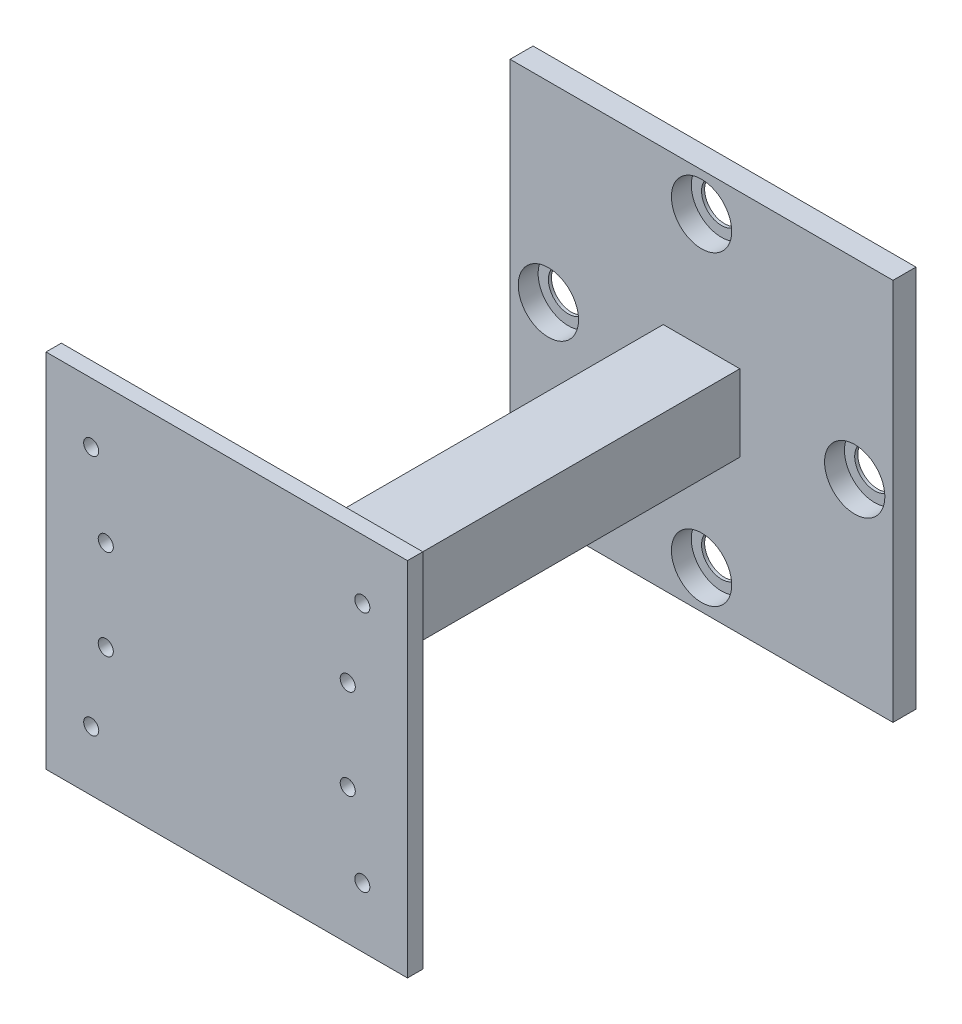
ISO-10303-21;
HEADER;
FILE_DESCRIPTION(('STEP AP214'),'2;1');
FILE_NAME('part.step','',(''),(''),'','','');
FILE_SCHEMA(('AUTOMOTIVE_DESIGN { 1 0 10303 214 1 1 1 1 }'));
ENDSEC;
DATA;
#1=APPLICATION_CONTEXT('core data for automotive mechanical design processes');
#2=APPLICATION_PROTOCOL_DEFINITION('international standard','automotive_design',2000,#1);
#3=PRODUCT_CONTEXT('',#1,'mechanical');
#4=PRODUCT('Part','Part','',(#3));
#5=PRODUCT_RELATED_PRODUCT_CATEGORY('part','',(#4));
#6=PRODUCT_DEFINITION_FORMATION('','',#4);
#7=PRODUCT_DEFINITION_CONTEXT('part definition',#1,'design');
#8=PRODUCT_DEFINITION('design','',#6,#7);
#9=PRODUCT_DEFINITION_SHAPE('','',#8);
#10=(LENGTH_UNIT() NAMED_UNIT(*) SI_UNIT(.MILLI.,.METRE.));
#11=(NAMED_UNIT(*) PLANE_ANGLE_UNIT() SI_UNIT($,.RADIAN.));
#12=(NAMED_UNIT(*) SI_UNIT($,.STERADIAN.) SOLID_ANGLE_UNIT());
#13=UNCERTAINTY_MEASURE_WITH_UNIT(LENGTH_MEASURE(1.E-05),#10,'distance_accuracy_value','');
#14=(GEOMETRIC_REPRESENTATION_CONTEXT(3) GLOBAL_UNCERTAINTY_ASSIGNED_CONTEXT((#13)) GLOBAL_UNIT_ASSIGNED_CONTEXT((#10,
#11,#12)) REPRESENTATION_CONTEXT('',''));
#15=CARTESIAN_POINT('',(0.,0.,0.));
#16=DIRECTION('',(0.,0.,1.));
#17=DIRECTION('',(1.,0.,0.));
#18=AXIS2_PLACEMENT_3D('',#15,#16,#17);
#19=CARTESIAN_POINT('',(0.,63.5,3.81));
#20=DIRECTION('',(1.,0.,0.));
#21=DIRECTION('',(0.,0.,-1.));
#22=AXIS2_PLACEMENT_3D('',#19,#20,#21);
#23=PLANE('',#22);
#24=DIRECTION('',(0.,-1.,0.));
#25=VECTOR('',#24,1.);
#26=CARTESIAN_POINT('',(0.,63.5,0.));
#27=LINE('',#26,#25);
#28=CARTESIAN_POINT('',(0.,63.5,0.));
#29=VERTEX_POINT('',#28);
#30=CARTESIAN_POINT('',(0.,0.,0.));
#31=VERTEX_POINT('',#30);
#32=EDGE_CURVE('E213',#29,#31,#27,.T.);
#33=ORIENTED_EDGE('',*,*,#32,.T.);
#34=DIRECTION('',(0.,0.,-1.));
#35=VECTOR('',#34,1.);
#36=CARTESIAN_POINT('',(0.,0.,3.81));
#37=LINE('',#36,#35);
#38=CARTESIAN_POINT('',(0.,0.,3.81));
#39=VERTEX_POINT('',#38);
#40=EDGE_CURVE('E11',#39,#31,#37,.T.);
#41=ORIENTED_EDGE('',*,*,#40,.F.);
#42=DIRECTION('',(0.,-1.,0.));
#43=VECTOR('',#42,1.);
#44=CARTESIAN_POINT('',(0.,63.5,3.81));
#45=LINE('',#44,#43);
#46=CARTESIAN_POINT('',(0.,63.5,3.81));
#47=VERTEX_POINT('',#46);
#48=EDGE_CURVE('E214',#47,#39,#45,.T.);
#49=ORIENTED_EDGE('',*,*,#48,.F.);
#50=DIRECTION('',(0.,0.,-1.));
#51=VECTOR('',#50,1.);
#52=CARTESIAN_POINT('',(0.,63.5,3.81));
#53=LINE('',#52,#51);
#54=EDGE_CURVE('E228',#47,#29,#53,.T.);
#55=ORIENTED_EDGE('',*,*,#54,.T.);
#56=EDGE_LOOP('',(#33,#41,#49,#55));
#57=FACE_BOUND('',#56,.T.);
#58=ADVANCED_FACE('F45',(#57),#23,.F.);
#59=CARTESIAN_POINT('',(0.,0.,3.81));
#60=DIRECTION('',(0.,1.,0.));
#61=DIRECTION('',(0.,0.,1.));
#62=AXIS2_PLACEMENT_3D('',#59,#60,#61);
#63=PLANE('',#62);
#64=DIRECTION('',(1.,0.,0.));
#65=VECTOR('',#64,1.);
#66=CARTESIAN_POINT('',(0.,0.,0.));
#67=LINE('',#66,#65);
#68=CARTESIAN_POINT('',(63.5,0.,0.));
#69=VERTEX_POINT('',#68);
#70=EDGE_CURVE('E232',#31,#69,#67,.T.);
#71=ORIENTED_EDGE('',*,*,#70,.T.);
#72=DIRECTION('',(0.,0.,-1.));
#73=VECTOR('',#72,1.);
#74=CARTESIAN_POINT('',(63.5,0.,3.81));
#75=LINE('',#74,#73);
#76=CARTESIAN_POINT('',(63.5,0.,3.81));
#77=VERTEX_POINT('',#76);
#78=EDGE_CURVE('E54',#77,#69,#75,.T.);
#79=ORIENTED_EDGE('',*,*,#78,.F.);
#80=DIRECTION('',(1.,0.,0.));
#81=VECTOR('',#80,1.);
#82=CARTESIAN_POINT('',(0.,0.,3.81));
#83=LINE('',#82,#81);
#84=EDGE_CURVE('E218',#39,#77,#83,.T.);
#85=ORIENTED_EDGE('',*,*,#84,.F.);
#86=ORIENTED_EDGE('',*,*,#40,.T.);
#87=EDGE_LOOP('',(#71,#79,#85,#86));
#88=FACE_BOUND('',#87,.T.);
#89=ADVANCED_FACE('F419',(#88),#63,.F.);
#90=CARTESIAN_POINT('',(63.5,0.,3.81));
#91=DIRECTION('',(-1.,0.,0.));
#92=DIRECTION('',(0.,0.,1.));
#93=AXIS2_PLACEMENT_3D('',#90,#91,#92);
#94=PLANE('',#93);
#95=DIRECTION('',(0.,1.,0.));
#96=VECTOR('',#95,1.);
#97=CARTESIAN_POINT('',(63.5,0.,0.));
#98=LINE('',#97,#96);
#99=CARTESIAN_POINT('',(63.5,63.5,0.));
#100=VERTEX_POINT('',#99);
#101=EDGE_CURVE('E235',#69,#100,#98,.T.);
#102=ORIENTED_EDGE('',*,*,#101,.T.);
#103=DIRECTION('',(0.,0.,-1.));
#104=VECTOR('',#103,1.);
#105=CARTESIAN_POINT('',(63.5,63.5,3.81));
#106=LINE('',#105,#104);
#107=CARTESIAN_POINT('',(63.5,63.5,3.81));
#108=VERTEX_POINT('',#107);
#109=EDGE_CURVE('E243',#108,#100,#106,.T.);
#110=ORIENTED_EDGE('',*,*,#109,.F.);
#111=DIRECTION('',(0.,1.,0.));
#112=VECTOR('',#111,1.);
#113=CARTESIAN_POINT('',(63.5,0.,3.81));
#114=LINE('',#113,#112);
#115=EDGE_CURVE('E222',#77,#108,#114,.T.);
#116=ORIENTED_EDGE('',*,*,#115,.F.);
#117=ORIENTED_EDGE('',*,*,#78,.T.);
#118=EDGE_LOOP('',(#102,#110,#116,#117));
#119=FACE_BOUND('',#118,.T.);
#120=ADVANCED_FACE('F424',(#119),#94,.F.);
#121=CARTESIAN_POINT('',(63.5,63.5,3.81));
#122=DIRECTION('',(0.,-1.,0.));
#123=DIRECTION('',(0.,0.,-1.));
#124=AXIS2_PLACEMENT_3D('',#121,#122,#123);
#125=PLANE('',#124);
#126=DIRECTION('',(-1.,0.,0.));
#127=VECTOR('',#126,1.);
#128=CARTESIAN_POINT('',(63.5,63.5,0.));
#129=LINE('',#128,#127);
#130=EDGE_CURVE('E219',#100,#29,#129,.T.);
#131=ORIENTED_EDGE('',*,*,#130,.T.);
#132=ORIENTED_EDGE('',*,*,#54,.F.);
#133=DIRECTION('',(-1.,0.,0.));
#134=VECTOR('',#133,1.);
#135=CARTESIAN_POINT('',(63.5,63.5,3.81));
#136=LINE('',#135,#134);
#137=EDGE_CURVE('E225',#108,#47,#136,.T.);
#138=ORIENTED_EDGE('',*,*,#137,.F.);
#139=ORIENTED_EDGE('',*,*,#109,.T.);
#140=EDGE_LOOP('',(#131,#132,#138,#139));
#141=FACE_BOUND('',#140,.T.);
#142=ADVANCED_FACE('F441',(#141),#125,.F.);
#143=CARTESIAN_POINT('',(0.,0.,3.81));
#144=DIRECTION('',(0.,0.,1.));
#145=DIRECTION('',(1.,0.,0.));
#146=AXIS2_PLACEMENT_3D('',#143,#144,#145);
#147=PLANE('',#146);
#148=CARTESIAN_POINT('',(57.15,31.75,3.81));
#149=DIRECTION('',(0.,0.,1.));
#150=DIRECTION('',(1.,0.,0.));
#151=AXIS2_PLACEMENT_3D('',#148,#149,#150);
#152=CIRCLE('',#151,5.);
#153=CARTESIAN_POINT('',(62.15,31.75,3.81));
#154=VERTEX_POINT('',#153);
#155=EDGE_CURVE('E277',#154,#154,#152,.T.);
#156=ORIENTED_EDGE('',*,*,#155,.F.);
#157=EDGE_LOOP('',(#156));
#158=FACE_BOUND('',#157,.T.);
#159=CARTESIAN_POINT('',(31.75,6.35,3.81));
#160=DIRECTION('',(0.,0.,1.));
#161=DIRECTION('',(1.,0.,0.));
#162=AXIS2_PLACEMENT_3D('',#159,#160,#161);
#163=CIRCLE('',#162,5.);
#164=CARTESIAN_POINT('',(36.75,6.35,3.81));
#165=VERTEX_POINT('',#164);
#166=EDGE_CURVE('E271',#165,#165,#163,.T.);
#167=ORIENTED_EDGE('',*,*,#166,.F.);
#168=EDGE_LOOP('',(#167));
#169=FACE_BOUND('',#168,.T.);
#170=CARTESIAN_POINT('',(31.75,57.15,3.81));
#171=DIRECTION('',(0.,0.,1.));
#172=DIRECTION('',(1.,0.,0.));
#173=AXIS2_PLACEMENT_3D('',#170,#171,#172);
#174=CIRCLE('',#173,5.);
#175=CARTESIAN_POINT('',(36.75,57.15,3.81));
#176=VERTEX_POINT('',#175);
#177=EDGE_CURVE('E265',#176,#176,#174,.T.);
#178=ORIENTED_EDGE('',*,*,#177,.F.);
#179=EDGE_LOOP('',(#178));
#180=FACE_BOUND('',#179,.T.);
#181=CARTESIAN_POINT('',(6.35,31.75,3.81));
#182=DIRECTION('',(0.,0.,1.));
#183=DIRECTION('',(1.,0.,0.));
#184=AXIS2_PLACEMENT_3D('',#181,#182,#183);
#185=CIRCLE('',#184,5.);
#186=CARTESIAN_POINT('',(11.35,31.75,3.81));
#187=VERTEX_POINT('',#186);
#188=EDGE_CURVE('E259',#187,#187,#185,.T.);
#189=ORIENTED_EDGE('',*,*,#188,.F.);
#190=EDGE_LOOP('',(#189));
#191=FACE_BOUND('',#190,.T.);
#192=DIRECTION('',(-1.,0.,0.));
#193=VECTOR('',#192,1.);
#194=CARTESIAN_POINT('',(38.1,38.1,3.81));
#195=LINE('',#194,#193);
#196=CARTESIAN_POINT('',(38.1,38.1,3.81));
#197=VERTEX_POINT('',#196);
#198=CARTESIAN_POINT('',(25.4,38.1,3.81));
#199=VERTEX_POINT('',#198);
#200=EDGE_CURVE('E62',#197,#199,#195,.T.);
#201=ORIENTED_EDGE('',*,*,#200,.F.);
#202=DIRECTION('',(0.,1.,0.));
#203=VECTOR('',#202,1.);
#204=CARTESIAN_POINT('',(38.1,25.4,3.81));
#205=LINE('',#204,#203);
#206=CARTESIAN_POINT('',(38.1,25.4,3.81));
#207=VERTEX_POINT('',#206);
#208=EDGE_CURVE('E66',#207,#197,#205,.T.);
#209=ORIENTED_EDGE('',*,*,#208,.F.);
#210=DIRECTION('',(1.,0.,0.));
#211=VECTOR('',#210,1.);
#212=CARTESIAN_POINT('',(25.4,25.4,3.81));
#213=LINE('',#212,#211);
#214=CARTESIAN_POINT('',(25.4,25.4,3.81));
#215=VERTEX_POINT('',#214);
#216=EDGE_CURVE('E193',#215,#207,#213,.T.);
#217=ORIENTED_EDGE('',*,*,#216,.F.);
#218=DIRECTION('',(0.,-1.,0.));
#219=VECTOR('',#218,1.);
#220=CARTESIAN_POINT('',(25.4,38.1,3.81));
#221=LINE('',#220,#219);
#222=EDGE_CURVE('E167',#199,#215,#221,.T.);
#223=ORIENTED_EDGE('',*,*,#222,.F.);
#224=EDGE_LOOP('',(#201,#209,#217,#223));
#225=FACE_BOUND('',#224,.T.);
#226=ORIENTED_EDGE('',*,*,#48,.T.);
#227=ORIENTED_EDGE('',*,*,#84,.T.);
#228=ORIENTED_EDGE('',*,*,#115,.T.);
#229=ORIENTED_EDGE('',*,*,#137,.T.);
#230=EDGE_LOOP('',(#226,#227,#228,#229));
#231=FACE_BOUND('',#230,.T.);
#232=ADVANCED_FACE('F437',(#158,#169,#180,#191,#225,#231),#147,.T.);
#233=CARTESIAN_POINT('',(0.,0.,0.));
#234=DIRECTION('',(0.,0.,1.));
#235=DIRECTION('',(1.,0.,0.));
#236=AXIS2_PLACEMENT_3D('',#233,#234,#235);
#237=PLANE('',#236);
#238=CARTESIAN_POINT('',(57.15,31.75,0.));
#239=DIRECTION('',(0.,0.,1.));
#240=DIRECTION('',(1.,0.,0.));
#241=AXIS2_PLACEMENT_3D('',#238,#239,#240);
#242=CIRCLE('',#241,3.3);
#243=CARTESIAN_POINT('',(60.45,31.75,0.));
#244=VERTEX_POINT('',#243);
#245=EDGE_CURVE('E267',#244,#244,#242,.T.);
#246=ORIENTED_EDGE('',*,*,#245,.T.);
#247=EDGE_LOOP('',(#246));
#248=FACE_BOUND('',#247,.T.);
#249=CARTESIAN_POINT('',(31.75,6.35,0.));
#250=DIRECTION('',(0.,0.,1.));
#251=DIRECTION('',(1.,0.,0.));
#252=AXIS2_PLACEMENT_3D('',#249,#250,#251);
#253=CIRCLE('',#252,3.3);
#254=CARTESIAN_POINT('',(35.05,6.35,0.));
#255=VERTEX_POINT('',#254);
#256=EDGE_CURVE('E261',#255,#255,#253,.T.);
#257=ORIENTED_EDGE('',*,*,#256,.T.);
#258=EDGE_LOOP('',(#257));
#259=FACE_BOUND('',#258,.T.);
#260=CARTESIAN_POINT('',(31.75,57.15,0.));
#261=DIRECTION('',(0.,0.,1.));
#262=DIRECTION('',(1.,0.,0.));
#263=AXIS2_PLACEMENT_3D('',#260,#261,#262);
#264=CIRCLE('',#263,3.3);
#265=CARTESIAN_POINT('',(35.05,57.15,0.));
#266=VERTEX_POINT('',#265);
#267=EDGE_CURVE('E255',#266,#266,#264,.T.);
#268=ORIENTED_EDGE('',*,*,#267,.T.);
#269=EDGE_LOOP('',(#268));
#270=FACE_BOUND('',#269,.T.);
#271=CARTESIAN_POINT('',(6.35,31.75,0.));
#272=DIRECTION('',(0.,0.,1.));
#273=DIRECTION('',(1.,0.,0.));
#274=AXIS2_PLACEMENT_3D('',#271,#272,#273);
#275=CIRCLE('',#274,3.3);
#276=CARTESIAN_POINT('',(9.65,31.75,0.));
#277=VERTEX_POINT('',#276);
#278=EDGE_CURVE('E250',#277,#277,#275,.T.);
#279=ORIENTED_EDGE('',*,*,#278,.T.);
#280=EDGE_LOOP('',(#279));
#281=FACE_BOUND('',#280,.T.);
#282=ORIENTED_EDGE('',*,*,#32,.F.);
#283=ORIENTED_EDGE('',*,*,#130,.F.);
#284=ORIENTED_EDGE('',*,*,#101,.F.);
#285=ORIENTED_EDGE('',*,*,#70,.F.);
#286=EDGE_LOOP('',(#282,#283,#284,#285));
#287=FACE_BOUND('',#286,.T.);
#288=ADVANCED_FACE('F432',(#248,#259,#270,#281,#287),#237,.F.);
#289=CARTESIAN_POINT('',(38.1,38.1,80.01));
#290=DIRECTION('',(0.,-1.,0.));
#291=DIRECTION('',(0.,0.,-1.));
#292=AXIS2_PLACEMENT_3D('',#289,#290,#291);
#293=PLANE('',#292);
#294=ORIENTED_EDGE('',*,*,#200,.T.);
#295=DIRECTION('',(0.,0.,-1.));
#296=VECTOR('',#295,1.);
#297=CARTESIAN_POINT('',(25.4,38.1,80.01));
#298=LINE('',#297,#296);
#299=CARTESIAN_POINT('',(25.4,38.1,80.01));
#300=VERTEX_POINT('',#299);
#301=EDGE_CURVE('E209',#300,#199,#298,.T.);
#302=ORIENTED_EDGE('',*,*,#301,.F.);
#303=DIRECTION('',(-1.,0.,0.));
#304=VECTOR('',#303,1.);
#305=CARTESIAN_POINT('',(38.1,38.1,80.01));
#306=LINE('',#305,#304);
#307=CARTESIAN_POINT('',(38.1,38.1,80.01));
#308=VERTEX_POINT('',#307);
#309=EDGE_CURVE('E173',#308,#300,#306,.T.);
#310=ORIENTED_EDGE('',*,*,#309,.F.);
#311=DIRECTION('',(0.,0.,-1.));
#312=VECTOR('',#311,1.);
#313=CARTESIAN_POINT('',(38.1,38.1,80.01));
#314=LINE('',#313,#312);
#315=EDGE_CURVE('E188',#308,#197,#314,.T.);
#316=ORIENTED_EDGE('',*,*,#315,.T.);
#317=EDGE_LOOP('',(#294,#302,#310,#316));
#318=FACE_BOUND('',#317,.T.);
#319=ADVANCED_FACE('F452',(#318),#293,.F.);
#320=CARTESIAN_POINT('',(25.4,38.1,80.01));
#321=DIRECTION('',(1.,0.,0.));
#322=DIRECTION('',(0.,0.,-1.));
#323=AXIS2_PLACEMENT_3D('',#320,#321,#322);
#324=PLANE('',#323);
#325=ORIENTED_EDGE('',*,*,#222,.T.);
#326=DIRECTION('',(0.,0.,-1.));
#327=VECTOR('',#326,1.);
#328=CARTESIAN_POINT('',(25.4,25.4,80.01));
#329=LINE('',#328,#327);
#330=CARTESIAN_POINT('',(25.4,25.4,80.01));
#331=VERTEX_POINT('',#330);
#332=EDGE_CURVE('E205',#331,#215,#329,.T.);
#333=ORIENTED_EDGE('',*,*,#332,.F.);
#334=DIRECTION('',(0.,-1.,0.));
#335=VECTOR('',#334,1.);
#336=CARTESIAN_POINT('',(25.4,38.1,80.01));
#337=LINE('',#336,#335);
#338=EDGE_CURVE('E177',#300,#331,#337,.T.);
#339=ORIENTED_EDGE('',*,*,#338,.F.);
#340=ORIENTED_EDGE('',*,*,#301,.T.);
#341=EDGE_LOOP('',(#325,#333,#339,#340));
#342=FACE_BOUND('',#341,.T.);
#343=ADVANCED_FACE('F459',(#342),#324,.F.);
#344=CARTESIAN_POINT('',(25.4,25.4,80.01));
#345=DIRECTION('',(0.,1.,0.));
#346=DIRECTION('',(0.,0.,1.));
#347=AXIS2_PLACEMENT_3D('',#344,#345,#346);
#348=PLANE('',#347);
#349=ORIENTED_EDGE('',*,*,#216,.T.);
#350=DIRECTION('',(0.,0.,-1.));
#351=VECTOR('',#350,1.);
#352=CARTESIAN_POINT('',(38.1,25.4,80.01));
#353=LINE('',#352,#351);
#354=CARTESIAN_POINT('',(38.1,25.4,80.01));
#355=VERTEX_POINT('',#354);
#356=EDGE_CURVE('E201',#355,#207,#353,.T.);
#357=ORIENTED_EDGE('',*,*,#356,.F.);
#358=DIRECTION('',(1.,0.,0.));
#359=VECTOR('',#358,1.);
#360=CARTESIAN_POINT('',(25.4,25.4,80.01));
#361=LINE('',#360,#359);
#362=EDGE_CURVE('E181',#331,#355,#361,.T.);
#363=ORIENTED_EDGE('',*,*,#362,.F.);
#364=ORIENTED_EDGE('',*,*,#332,.T.);
#365=EDGE_LOOP('',(#349,#357,#363,#364));
#366=FACE_BOUND('',#365,.T.);
#367=ADVANCED_FACE('F463',(#366),#348,.F.);
#368=CARTESIAN_POINT('',(38.1,25.4,80.01));
#369=DIRECTION('',(-1.,0.,0.));
#370=DIRECTION('',(0.,0.,1.));
#371=AXIS2_PLACEMENT_3D('',#368,#369,#370);
#372=PLANE('',#371);
#373=ORIENTED_EDGE('',*,*,#208,.T.);
#374=ORIENTED_EDGE('',*,*,#315,.F.);
#375=DIRECTION('',(0.,1.,0.));
#376=VECTOR('',#375,1.);
#377=CARTESIAN_POINT('',(38.1,25.4,80.01));
#378=LINE('',#377,#376);
#379=EDGE_CURVE('E185',#355,#308,#378,.T.);
#380=ORIENTED_EDGE('',*,*,#379,.F.);
#381=ORIENTED_EDGE('',*,*,#356,.T.);
#382=EDGE_LOOP('',(#373,#374,#380,#381));
#383=FACE_BOUND('',#382,.T.);
#384=ADVANCED_FACE('F467',(#383),#372,.F.);
#385=CARTESIAN_POINT('',(1.778,1.77799999999999,82.55));
#386=DIRECTION('',(1.,0.,0.));
#387=DIRECTION('',(0.,1.,0.));
#388=AXIS2_PLACEMENT_3D('',#385,#386,#387);
#389=PLANE('',#388);
#390=DIRECTION('',(0.,-1.,0.));
#391=VECTOR('',#390,1.);
#392=CARTESIAN_POINT('',(1.778,1.77799999999999,80.01));
#393=LINE('',#392,#391);
#394=CARTESIAN_POINT('',(1.778,61.722,80.01));
#395=VERTEX_POINT('',#394);
#396=CARTESIAN_POINT('',(1.778,1.77799999999999,80.01));
#397=VERTEX_POINT('',#396);
#398=EDGE_CURVE('E160',#395,#397,#393,.T.);
#399=ORIENTED_EDGE('',*,*,#398,.T.);
#400=DIRECTION('',(0.,0.,-1.));
#401=VECTOR('',#400,1.);
#402=CARTESIAN_POINT('',(1.778,1.77799999999999,82.55));
#403=LINE('',#402,#401);
#404=CARTESIAN_POINT('',(1.778,1.77799999999999,82.55));
#405=VERTEX_POINT('',#404);
#406=EDGE_CURVE('E138',#405,#397,#403,.T.);
#407=ORIENTED_EDGE('',*,*,#406,.F.);
#408=DIRECTION('',(0.,-1.,0.));
#409=VECTOR('',#408,1.);
#410=CARTESIAN_POINT('',(1.778,1.77799999999999,82.55));
#411=LINE('',#410,#409);
#412=CARTESIAN_POINT('',(1.778,61.722,82.55));
#413=VERTEX_POINT('',#412);
#414=EDGE_CURVE('E146',#413,#405,#411,.T.);
#415=ORIENTED_EDGE('',*,*,#414,.F.);
#416=DIRECTION('',(0.,0.,-1.));
#417=VECTOR('',#416,1.);
#418=CARTESIAN_POINT('',(1.778,61.722,82.55));
#419=LINE('',#418,#417);
#420=EDGE_CURVE('E385',#413,#395,#419,.T.);
#421=ORIENTED_EDGE('',*,*,#420,.T.);
#422=EDGE_LOOP('',(#399,#407,#415,#421));
#423=FACE_BOUND('',#422,.T.);
#424=ADVANCED_FACE('F158',(#423),#389,.F.);
#425=CARTESIAN_POINT('',(61.722,1.778,82.55));
#426=DIRECTION('',(0.,1.,0.));
#427=DIRECTION('',(-1.,0.,0.));
#428=AXIS2_PLACEMENT_3D('',#425,#426,#427);
#429=PLANE('',#428);
#430=DIRECTION('',(1.,0.,0.));
#431=VECTOR('',#430,1.);
#432=CARTESIAN_POINT('',(61.722,1.778,80.01));
#433=LINE('',#432,#431);
#434=CARTESIAN_POINT('',(61.722,1.778,80.01));
#435=VERTEX_POINT('',#434);
#436=EDGE_CURVE('E388',#397,#435,#433,.T.);
#437=ORIENTED_EDGE('',*,*,#436,.T.);
#438=DIRECTION('',(0.,0.,-1.));
#439=VECTOR('',#438,1.);
#440=CARTESIAN_POINT('',(61.722,1.778,82.55));
#441=LINE('',#440,#439);
#442=CARTESIAN_POINT('',(61.722,1.778,82.55));
#443=VERTEX_POINT('',#442);
#444=EDGE_CURVE('E141',#443,#435,#441,.T.);
#445=ORIENTED_EDGE('',*,*,#444,.F.);
#446=DIRECTION('',(1.,0.,0.));
#447=VECTOR('',#446,1.);
#448=CARTESIAN_POINT('',(61.722,1.778,82.55));
#449=LINE('',#448,#447);
#450=EDGE_CURVE('E134',#405,#443,#449,.T.);
#451=ORIENTED_EDGE('',*,*,#450,.F.);
#452=ORIENTED_EDGE('',*,*,#406,.T.);
#453=EDGE_LOOP('',(#437,#445,#451,#452));
#454=FACE_BOUND('',#453,.T.);
#455=ADVANCED_FACE('F136',(#454),#429,.F.);
#456=CARTESIAN_POINT('',(61.722,61.722,82.55));
#457=DIRECTION('',(-1.,0.,0.));
#458=DIRECTION('',(0.,0.,1.));
#459=AXIS2_PLACEMENT_3D('',#456,#457,#458);
#460=PLANE('',#459);
#461=DIRECTION('',(0.,1.,0.));
#462=VECTOR('',#461,1.);
#463=CARTESIAN_POINT('',(61.722,61.722,80.01));
#464=LINE('',#463,#462);
#465=CARTESIAN_POINT('',(61.722,61.722,80.01));
#466=VERTEX_POINT('',#465);
#467=EDGE_CURVE('E391',#435,#466,#464,.T.);
#468=ORIENTED_EDGE('',*,*,#467,.T.);
#469=DIRECTION('',(0.,0.,-1.));
#470=VECTOR('',#469,1.);
#471=CARTESIAN_POINT('',(61.722,61.722,82.55));
#472=LINE('',#471,#470);
#473=CARTESIAN_POINT('',(61.722,61.722,82.55));
#474=VERTEX_POINT('',#473);
#475=EDGE_CURVE('E169',#474,#466,#472,.T.);
#476=ORIENTED_EDGE('',*,*,#475,.F.);
#477=DIRECTION('',(0.,1.,0.));
#478=VECTOR('',#477,1.);
#479=CARTESIAN_POINT('',(61.722,61.722,82.55));
#480=LINE('',#479,#478);
#481=EDGE_CURVE('E145',#443,#474,#480,.T.);
#482=ORIENTED_EDGE('',*,*,#481,.F.);
#483=ORIENTED_EDGE('',*,*,#444,.T.);
#484=EDGE_LOOP('',(#468,#476,#482,#483));
#485=FACE_BOUND('',#484,.T.);
#486=ADVANCED_FACE('F409',(#485),#460,.F.);
#487=CARTESIAN_POINT('',(1.778,61.722,82.55));
#488=DIRECTION('',(0.,-1.,0.));
#489=DIRECTION('',(0.,0.,-1.));
#490=AXIS2_PLACEMENT_3D('',#487,#488,#489);
#491=PLANE('',#490);
#492=DIRECTION('',(-1.,0.,0.));
#493=VECTOR('',#492,1.);
#494=CARTESIAN_POINT('',(1.778,61.722,80.01));
#495=LINE('',#494,#493);
#496=EDGE_CURVE('E156',#466,#395,#495,.T.);
#497=ORIENTED_EDGE('',*,*,#496,.T.);
#498=ORIENTED_EDGE('',*,*,#420,.F.);
#499=DIRECTION('',(-1.,0.,0.));
#500=VECTOR('',#499,1.);
#501=CARTESIAN_POINT('',(1.778,61.722,82.55));
#502=LINE('',#501,#500);
#503=EDGE_CURVE('E151',#474,#413,#502,.T.);
#504=ORIENTED_EDGE('',*,*,#503,.F.);
#505=ORIENTED_EDGE('',*,*,#475,.T.);
#506=EDGE_LOOP('',(#497,#498,#504,#505));
#507=FACE_BOUND('',#506,.T.);
#508=ADVANCED_FACE('F404',(#507),#491,.F.);
#509=CARTESIAN_POINT('',(0.,0.,82.55));
#510=DIRECTION('',(0.,0.,-1.));
#511=DIRECTION('',(-1.,0.,0.));
#512=AXIS2_PLACEMENT_3D('',#509,#510,#511);
#513=PLANE('',#512);
#514=CARTESIAN_POINT('',(9.271,51.816,82.55));
#515=DIRECTION('',(0.,0.,1.));
#516=DIRECTION('',(1.,0.,0.));
#517=AXIS2_PLACEMENT_3D('',#514,#515,#516);
#518=CIRCLE('',#517,1.25);
#519=CARTESIAN_POINT('',(10.521,51.816,82.55));
#520=VERTEX_POINT('',#519);
#521=EDGE_CURVE('E323',#520,#520,#518,.T.);
#522=ORIENTED_EDGE('',*,*,#521,.F.);
#523=EDGE_LOOP('',(#522));
#524=FACE_BOUND('',#523,.T.);
#525=CARTESIAN_POINT('',(9.271,11.684,82.55));
#526=DIRECTION('',(0.,0.,1.));
#527=DIRECTION('',(1.,0.,0.));
#528=AXIS2_PLACEMENT_3D('',#525,#526,#527);
#529=CIRCLE('',#528,1.25);
#530=CARTESIAN_POINT('',(10.521,11.684,82.55));
#531=VERTEX_POINT('',#530);
#532=EDGE_CURVE('E306',#531,#531,#529,.T.);
#533=ORIENTED_EDGE('',*,*,#532,.F.);
#534=EDGE_LOOP('',(#533));
#535=FACE_BOUND('',#534,.T.);
#536=CARTESIAN_POINT('',(54.229,11.684,82.55));
#537=DIRECTION('',(0.,0.,1.));
#538=DIRECTION('',(1.,0.,0.));
#539=AXIS2_PLACEMENT_3D('',#536,#537,#538);
#540=CIRCLE('',#539,1.25);
#541=CARTESIAN_POINT('',(55.479,11.684,82.55));
#542=VERTEX_POINT('',#541);
#543=EDGE_CURVE('E302',#542,#542,#540,.T.);
#544=ORIENTED_EDGE('',*,*,#543,.F.);
#545=EDGE_LOOP('',(#544));
#546=FACE_BOUND('',#545,.T.);
#547=CARTESIAN_POINT('',(54.229,51.816,82.55));
#548=DIRECTION('',(0.,0.,1.));
#549=DIRECTION('',(1.,0.,0.));
#550=AXIS2_PLACEMENT_3D('',#547,#548,#549);
#551=CIRCLE('',#550,1.25);
#552=CARTESIAN_POINT('',(55.479,51.816,82.55));
#553=VERTEX_POINT('',#552);
#554=EDGE_CURVE('E298',#553,#553,#551,.T.);
#555=ORIENTED_EDGE('',*,*,#554,.F.);
#556=EDGE_LOOP('',(#555));
#557=FACE_BOUND('',#556,.T.);
#558=CARTESIAN_POINT('',(11.684,39.243,82.55));
#559=DIRECTION('',(0.,0.,1.));
#560=DIRECTION('',(1.,0.,0.));
#561=AXIS2_PLACEMENT_3D('',#558,#559,#560);
#562=CIRCLE('',#561,1.25);
#563=CARTESIAN_POINT('',(12.934,39.243,82.55));
#564=VERTEX_POINT('',#563);
#565=EDGE_CURVE('E293',#564,#564,#562,.T.);
#566=ORIENTED_EDGE('',*,*,#565,.F.);
#567=EDGE_LOOP('',(#566));
#568=FACE_BOUND('',#567,.T.);
#569=CARTESIAN_POINT('',(11.684,24.257,82.55));
#570=DIRECTION('',(0.,0.,1.));
#571=DIRECTION('',(1.,0.,0.));
#572=AXIS2_PLACEMENT_3D('',#569,#570,#571);
#573=CIRCLE('',#572,1.25);
#574=CARTESIAN_POINT('',(12.934,24.257,82.55));
#575=VERTEX_POINT('',#574);
#576=EDGE_CURVE('E288',#575,#575,#573,.T.);
#577=ORIENTED_EDGE('',*,*,#576,.F.);
#578=EDGE_LOOP('',(#577));
#579=FACE_BOUND('',#578,.T.);
#580=CARTESIAN_POINT('',(51.816,39.243,82.55));
#581=DIRECTION('',(0.,0.,1.));
#582=DIRECTION('',(1.,0.,0.));
#583=AXIS2_PLACEMENT_3D('',#580,#581,#582);
#584=CIRCLE('',#583,1.25);
#585=CARTESIAN_POINT('',(53.066,39.243,82.55));
#586=VERTEX_POINT('',#585);
#587=EDGE_CURVE('E283',#586,#586,#584,.T.);
#588=ORIENTED_EDGE('',*,*,#587,.F.);
#589=EDGE_LOOP('',(#588));
#590=FACE_BOUND('',#589,.T.);
#591=CARTESIAN_POINT('',(51.816,24.257,82.55));
#592=DIRECTION('',(0.,0.,1.));
#593=DIRECTION('',(1.,0.,0.));
#594=AXIS2_PLACEMENT_3D('',#591,#592,#593);
#595=CIRCLE('',#594,1.25);
#596=CARTESIAN_POINT('',(53.066,24.257,82.55));
#597=VERTEX_POINT('',#596);
#598=EDGE_CURVE('E278',#597,#597,#595,.T.);
#599=ORIENTED_EDGE('',*,*,#598,.F.);
#600=EDGE_LOOP('',(#599));
#601=FACE_BOUND('',#600,.T.);
#602=ORIENTED_EDGE('',*,*,#414,.T.);
#603=ORIENTED_EDGE('',*,*,#450,.T.);
#604=ORIENTED_EDGE('',*,*,#481,.T.);
#605=ORIENTED_EDGE('',*,*,#503,.T.);
#606=EDGE_LOOP('',(#602,#603,#604,#605));
#607=FACE_BOUND('',#606,.T.);
#608=ADVANCED_FACE('F149',(#524,#535,#546,#557,#568,#579,#590,#601,#607),#513,.F.);
#609=CARTESIAN_POINT('',(0.,0.,80.01));
#610=DIRECTION('',(0.,0.,-1.));
#611=DIRECTION('',(-1.,0.,0.));
#612=AXIS2_PLACEMENT_3D('',#609,#610,#611);
#613=PLANE('',#612);
#614=CARTESIAN_POINT('',(9.271,51.816,80.01));
#615=DIRECTION('',(0.,0.,-1.));
#616=DIRECTION('',(-1.,0.,0.));
#617=AXIS2_PLACEMENT_3D('',#614,#615,#616);
#618=CIRCLE('',#617,1.25);
#619=CARTESIAN_POINT('',(8.021,51.816,80.01));
#620=VERTEX_POINT('',#619);
#621=EDGE_CURVE('E48',#620,#620,#618,.T.);
#622=ORIENTED_EDGE('',*,*,#621,.F.);
#623=EDGE_LOOP('',(#622));
#624=FACE_BOUND('',#623,.T.);
#625=CARTESIAN_POINT('',(9.271,11.684,80.01));
#626=DIRECTION('',(0.,0.,-1.));
#627=DIRECTION('',(-1.,0.,0.));
#628=AXIS2_PLACEMENT_3D('',#625,#626,#627);
#629=CIRCLE('',#628,1.25);
#630=CARTESIAN_POINT('',(8.021,11.684,80.01));
#631=VERTEX_POINT('',#630);
#632=EDGE_CURVE('E303',#631,#631,#629,.T.);
#633=ORIENTED_EDGE('',*,*,#632,.F.);
#634=EDGE_LOOP('',(#633));
#635=FACE_BOUND('',#634,.T.);
#636=CARTESIAN_POINT('',(54.229,11.684,80.01));
#637=DIRECTION('',(0.,0.,-1.));
#638=DIRECTION('',(-1.,0.,0.));
#639=AXIS2_PLACEMENT_3D('',#636,#637,#638);
#640=CIRCLE('',#639,1.25);
#641=CARTESIAN_POINT('',(52.979,11.684,80.01));
#642=VERTEX_POINT('',#641);
#643=EDGE_CURVE('E299',#642,#642,#640,.T.);
#644=ORIENTED_EDGE('',*,*,#643,.F.);
#645=EDGE_LOOP('',(#644));
#646=FACE_BOUND('',#645,.T.);
#647=CARTESIAN_POINT('',(54.229,51.816,80.01));
#648=DIRECTION('',(0.,0.,-1.));
#649=DIRECTION('',(-1.,0.,0.));
#650=AXIS2_PLACEMENT_3D('',#647,#648,#649);
#651=CIRCLE('',#650,1.25);
#652=CARTESIAN_POINT('',(52.979,51.816,80.01));
#653=VERTEX_POINT('',#652);
#654=EDGE_CURVE('E294',#653,#653,#651,.T.);
#655=ORIENTED_EDGE('',*,*,#654,.F.);
#656=EDGE_LOOP('',(#655));
#657=FACE_BOUND('',#656,.T.);
#658=CARTESIAN_POINT('',(11.684,39.243,80.01));
#659=DIRECTION('',(0.,0.,-1.));
#660=DIRECTION('',(-1.,0.,0.));
#661=AXIS2_PLACEMENT_3D('',#658,#659,#660);
#662=CIRCLE('',#661,1.25);
#663=CARTESIAN_POINT('',(10.434,39.243,80.01));
#664=VERTEX_POINT('',#663);
#665=EDGE_CURVE('E289',#664,#664,#662,.T.);
#666=ORIENTED_EDGE('',*,*,#665,.F.);
#667=EDGE_LOOP('',(#666));
#668=FACE_BOUND('',#667,.T.);
#669=CARTESIAN_POINT('',(11.684,24.257,80.01));
#670=DIRECTION('',(0.,0.,-1.));
#671=DIRECTION('',(-1.,0.,0.));
#672=AXIS2_PLACEMENT_3D('',#669,#670,#671);
#673=CIRCLE('',#672,1.25);
#674=CARTESIAN_POINT('',(10.434,24.257,80.01));
#675=VERTEX_POINT('',#674);
#676=EDGE_CURVE('E284',#675,#675,#673,.T.);
#677=ORIENTED_EDGE('',*,*,#676,.F.);
#678=EDGE_LOOP('',(#677));
#679=FACE_BOUND('',#678,.T.);
#680=CARTESIAN_POINT('',(51.816,39.243,80.01));
#681=DIRECTION('',(0.,0.,-1.));
#682=DIRECTION('',(-1.,0.,0.));
#683=AXIS2_PLACEMENT_3D('',#680,#681,#682);
#684=CIRCLE('',#683,1.25);
#685=CARTESIAN_POINT('',(50.566,39.243,80.01));
#686=VERTEX_POINT('',#685);
#687=EDGE_CURVE('E279',#686,#686,#684,.T.);
#688=ORIENTED_EDGE('',*,*,#687,.F.);
#689=EDGE_LOOP('',(#688));
#690=FACE_BOUND('',#689,.T.);
#691=CARTESIAN_POINT('',(51.816,24.257,80.01));
#692=DIRECTION('',(0.,0.,-1.));
#693=DIRECTION('',(-1.,0.,0.));
#694=AXIS2_PLACEMENT_3D('',#691,#692,#693);
#695=CIRCLE('',#694,1.25);
#696=CARTESIAN_POINT('',(50.566,24.257,80.01));
#697=VERTEX_POINT('',#696);
#698=EDGE_CURVE('E273',#697,#697,#695,.T.);
#699=ORIENTED_EDGE('',*,*,#698,.F.);
#700=EDGE_LOOP('',(#699));
#701=FACE_BOUND('',#700,.T.);
#702=ORIENTED_EDGE('',*,*,#379,.T.);
#703=ORIENTED_EDGE('',*,*,#309,.T.);
#704=ORIENTED_EDGE('',*,*,#338,.T.);
#705=ORIENTED_EDGE('',*,*,#362,.T.);
#706=EDGE_LOOP('',(#702,#703,#704,#705));
#707=FACE_BOUND('',#706,.T.);
#708=ORIENTED_EDGE('',*,*,#398,.F.);
#709=ORIENTED_EDGE('',*,*,#496,.F.);
#710=ORIENTED_EDGE('',*,*,#467,.F.);
#711=ORIENTED_EDGE('',*,*,#436,.F.);
#712=EDGE_LOOP('',(#708,#709,#710,#711));
#713=FACE_BOUND('',#712,.T.);
#714=ADVANCED_FACE('F408',(#624,#635,#646,#657,#668,#679,#690,#701,#707,#713),#613,.T.);
#715=CARTESIAN_POINT('',(6.35,31.75,3.81));
#716=DIRECTION('',(0.,0.,1.));
#717=DIRECTION('',(1.,0.,0.));
#718=AXIS2_PLACEMENT_3D('',#715,#716,#717);
#719=CYLINDRICAL_SURFACE('',#718,3.3);
#720=CARTESIAN_POINT('',(6.35,31.75,0.51));
#721=DIRECTION('',(0.,0.,1.));
#722=DIRECTION('',(1.,0.,0.));
#723=AXIS2_PLACEMENT_3D('',#720,#721,#722);
#724=CIRCLE('',#723,3.3);
#725=CARTESIAN_POINT('',(9.65,31.75,0.51));
#726=VERTEX_POINT('',#725);
#727=EDGE_CURVE('E254',#726,#726,#724,.T.);
#728=ORIENTED_EDGE('',*,*,#727,.T.);
#729=EDGE_LOOP('',(#728));
#730=FACE_BOUND('',#729,.T.);
#731=ORIENTED_EDGE('',*,*,#278,.F.);
#732=EDGE_LOOP('',(#731));
#733=FACE_BOUND('',#732,.T.);
#734=ADVANCED_FACE('F517',(#730,#733),#719,.F.);
#735=CARTESIAN_POINT('',(9.65,31.75,0.51));
#736=DIRECTION('',(0.,0.,-1.));
#737=DIRECTION('',(-1.,0.,0.));
#738=AXIS2_PLACEMENT_3D('',#735,#736,#737);
#739=PLANE('',#738);
#740=ORIENTED_EDGE('',*,*,#727,.F.);
#741=EDGE_LOOP('',(#740));
#742=FACE_BOUND('',#741,.T.);
#743=CARTESIAN_POINT('',(6.35,31.75,0.51));
#744=DIRECTION('',(0.,0.,1.));
#745=DIRECTION('',(1.,0.,0.));
#746=AXIS2_PLACEMENT_3D('',#743,#744,#745);
#747=CIRCLE('',#746,5.);
#748=CARTESIAN_POINT('',(11.35,31.75,0.51));
#749=VERTEX_POINT('',#748);
#750=EDGE_CURVE('E374',#749,#749,#747,.T.);
#751=ORIENTED_EDGE('',*,*,#750,.T.);
#752=EDGE_LOOP('',(#751));
#753=FACE_BOUND('',#752,.T.);
#754=ADVANCED_FACE('F522',(#742,#753),#739,.F.);
#755=CARTESIAN_POINT('',(6.35,31.75,3.81));
#756=DIRECTION('',(0.,0.,1.));
#757=DIRECTION('',(1.,0.,0.));
#758=AXIS2_PLACEMENT_3D('',#755,#756,#757);
#759=CYLINDRICAL_SURFACE('',#758,5.);
#760=ORIENTED_EDGE('',*,*,#750,.F.);
#761=EDGE_LOOP('',(#760));
#762=FACE_BOUND('',#761,.T.);
#763=ORIENTED_EDGE('',*,*,#188,.T.);
#764=EDGE_LOOP('',(#763));
#765=FACE_BOUND('',#764,.T.);
#766=ADVANCED_FACE('F535',(#762,#765),#759,.F.);
#767=CARTESIAN_POINT('',(31.75,57.15,3.81));
#768=DIRECTION('',(0.,0.,1.));
#769=DIRECTION('',(1.,0.,0.));
#770=AXIS2_PLACEMENT_3D('',#767,#768,#769);
#771=CYLINDRICAL_SURFACE('',#770,3.3);
#772=CARTESIAN_POINT('',(31.75,57.15,0.51));
#773=DIRECTION('',(0.,0.,1.));
#774=DIRECTION('',(1.,0.,0.));
#775=AXIS2_PLACEMENT_3D('',#772,#773,#774);
#776=CIRCLE('',#775,3.3);
#777=CARTESIAN_POINT('',(35.05,57.15,0.51));
#778=VERTEX_POINT('',#777);
#779=EDGE_CURVE('E260',#778,#778,#776,.T.);
#780=ORIENTED_EDGE('',*,*,#779,.T.);
#781=EDGE_LOOP('',(#780));
#782=FACE_BOUND('',#781,.T.);
#783=ORIENTED_EDGE('',*,*,#267,.F.);
#784=EDGE_LOOP('',(#783));
#785=FACE_BOUND('',#784,.T.);
#786=ADVANCED_FACE('F546',(#782,#785),#771,.F.);
#787=CARTESIAN_POINT('',(35.05,57.15,0.51));
#788=DIRECTION('',(0.,0.,-1.));
#789=DIRECTION('',(-1.,0.,0.));
#790=AXIS2_PLACEMENT_3D('',#787,#788,#789);
#791=PLANE('',#790);
#792=ORIENTED_EDGE('',*,*,#779,.F.);
#793=EDGE_LOOP('',(#792));
#794=FACE_BOUND('',#793,.T.);
#795=CARTESIAN_POINT('',(31.75,57.15,0.51));
#796=DIRECTION('',(0.,0.,1.));
#797=DIRECTION('',(1.,0.,0.));
#798=AXIS2_PLACEMENT_3D('',#795,#796,#797);
#799=CIRCLE('',#798,5.);
#800=CARTESIAN_POINT('',(36.75,57.15,0.51));
#801=VERTEX_POINT('',#800);
#802=EDGE_CURVE('E364',#801,#801,#799,.T.);
#803=ORIENTED_EDGE('',*,*,#802,.T.);
#804=EDGE_LOOP('',(#803));
#805=FACE_BOUND('',#804,.T.);
#806=ADVANCED_FACE('F557',(#794,#805),#791,.F.);
#807=CARTESIAN_POINT('',(31.75,57.15,3.81));
#808=DIRECTION('',(0.,0.,1.));
#809=DIRECTION('',(1.,0.,0.));
#810=AXIS2_PLACEMENT_3D('',#807,#808,#809);
#811=CYLINDRICAL_SURFACE('',#810,5.);
#812=ORIENTED_EDGE('',*,*,#802,.F.);
#813=EDGE_LOOP('',(#812));
#814=FACE_BOUND('',#813,.T.);
#815=ORIENTED_EDGE('',*,*,#177,.T.);
#816=EDGE_LOOP('',(#815));
#817=FACE_BOUND('',#816,.T.);
#818=ADVANCED_FACE('F568',(#814,#817),#811,.F.);
#819=CARTESIAN_POINT('',(31.75,6.35,3.81));
#820=DIRECTION('',(0.,0.,1.));
#821=DIRECTION('',(1.,0.,0.));
#822=AXIS2_PLACEMENT_3D('',#819,#820,#821);
#823=CYLINDRICAL_SURFACE('',#822,3.3);
#824=CARTESIAN_POINT('',(31.75,6.35,0.51));
#825=DIRECTION('',(0.,0.,1.));
#826=DIRECTION('',(1.,0.,0.));
#827=AXIS2_PLACEMENT_3D('',#824,#825,#826);
#828=CIRCLE('',#827,3.3);
#829=CARTESIAN_POINT('',(35.05,6.35,0.51));
#830=VERTEX_POINT('',#829);
#831=EDGE_CURVE('E266',#830,#830,#828,.T.);
#832=ORIENTED_EDGE('',*,*,#831,.T.);
#833=EDGE_LOOP('',(#832));
#834=FACE_BOUND('',#833,.T.);
#835=ORIENTED_EDGE('',*,*,#256,.F.);
#836=EDGE_LOOP('',(#835));
#837=FACE_BOUND('',#836,.T.);
#838=ADVANCED_FACE('F579',(#834,#837),#823,.F.);
#839=CARTESIAN_POINT('',(35.05,6.35,0.51));
#840=DIRECTION('',(0.,0.,-1.));
#841=DIRECTION('',(-1.,0.,0.));
#842=AXIS2_PLACEMENT_3D('',#839,#840,#841);
#843=PLANE('',#842);
#844=ORIENTED_EDGE('',*,*,#831,.F.);
#845=EDGE_LOOP('',(#844));
#846=FACE_BOUND('',#845,.T.);
#847=CARTESIAN_POINT('',(31.75,6.35,0.51));
#848=DIRECTION('',(0.,0.,1.));
#849=DIRECTION('',(1.,0.,0.));
#850=AXIS2_PLACEMENT_3D('',#847,#848,#849);
#851=CIRCLE('',#850,5.);
#852=CARTESIAN_POINT('',(36.75,6.35,0.51));
#853=VERTEX_POINT('',#852);
#854=EDGE_CURVE('E354',#853,#853,#851,.T.);
#855=ORIENTED_EDGE('',*,*,#854,.T.);
#856=EDGE_LOOP('',(#855));
#857=FACE_BOUND('',#856,.T.);
#858=ADVANCED_FACE('F590',(#846,#857),#843,.F.);
#859=CARTESIAN_POINT('',(31.75,6.35,3.81));
#860=DIRECTION('',(0.,0.,1.));
#861=DIRECTION('',(1.,0.,0.));
#862=AXIS2_PLACEMENT_3D('',#859,#860,#861);
#863=CYLINDRICAL_SURFACE('',#862,5.);
#864=ORIENTED_EDGE('',*,*,#854,.F.);
#865=EDGE_LOOP('',(#864));
#866=FACE_BOUND('',#865,.T.);
#867=ORIENTED_EDGE('',*,*,#166,.T.);
#868=EDGE_LOOP('',(#867));
#869=FACE_BOUND('',#868,.T.);
#870=ADVANCED_FACE('F601',(#866,#869),#863,.F.);
#871=CARTESIAN_POINT('',(57.15,31.75,3.81));
#872=DIRECTION('',(0.,0.,1.));
#873=DIRECTION('',(1.,0.,0.));
#874=AXIS2_PLACEMENT_3D('',#871,#872,#873);
#875=CYLINDRICAL_SURFACE('',#874,3.3);
#876=CARTESIAN_POINT('',(57.15,31.75,0.51));
#877=DIRECTION('',(0.,0.,1.));
#878=DIRECTION('',(1.,0.,0.));
#879=AXIS2_PLACEMENT_3D('',#876,#877,#878);
#880=CIRCLE('',#879,3.3);
#881=CARTESIAN_POINT('',(60.45,31.75,0.51));
#882=VERTEX_POINT('',#881);
#883=EDGE_CURVE('E272',#882,#882,#880,.T.);
#884=ORIENTED_EDGE('',*,*,#883,.T.);
#885=EDGE_LOOP('',(#884));
#886=FACE_BOUND('',#885,.T.);
#887=ORIENTED_EDGE('',*,*,#245,.F.);
#888=EDGE_LOOP('',(#887));
#889=FACE_BOUND('',#888,.T.);
#890=ADVANCED_FACE('F612',(#886,#889),#875,.F.);
#891=CARTESIAN_POINT('',(60.45,31.75,0.51));
#892=DIRECTION('',(0.,0.,-1.));
#893=DIRECTION('',(-1.,0.,0.));
#894=AXIS2_PLACEMENT_3D('',#891,#892,#893);
#895=PLANE('',#894);
#896=ORIENTED_EDGE('',*,*,#883,.F.);
#897=EDGE_LOOP('',(#896));
#898=FACE_BOUND('',#897,.T.);
#899=CARTESIAN_POINT('',(57.15,31.75,0.51));
#900=DIRECTION('',(0.,0.,1.));
#901=DIRECTION('',(1.,0.,0.));
#902=AXIS2_PLACEMENT_3D('',#899,#900,#901);
#903=CIRCLE('',#902,5.);
#904=CARTESIAN_POINT('',(62.15,31.75,0.51));
#905=VERTEX_POINT('',#904);
#906=EDGE_CURVE('E344',#905,#905,#903,.T.);
#907=ORIENTED_EDGE('',*,*,#906,.T.);
#908=EDGE_LOOP('',(#907));
#909=FACE_BOUND('',#908,.T.);
#910=ADVANCED_FACE('F623',(#898,#909),#895,.F.);
#911=CARTESIAN_POINT('',(57.15,31.75,3.81));
#912=DIRECTION('',(0.,0.,1.));
#913=DIRECTION('',(1.,0.,0.));
#914=AXIS2_PLACEMENT_3D('',#911,#912,#913);
#915=CYLINDRICAL_SURFACE('',#914,5.);
#916=ORIENTED_EDGE('',*,*,#906,.F.);
#917=EDGE_LOOP('',(#916));
#918=FACE_BOUND('',#917,.T.);
#919=ORIENTED_EDGE('',*,*,#155,.T.);
#920=EDGE_LOOP('',(#919));
#921=FACE_BOUND('',#920,.T.);
#922=ADVANCED_FACE('F634',(#918,#921),#915,.F.);
#923=CARTESIAN_POINT('',(51.816,24.257,82.55));
#924=DIRECTION('',(0.,0.,1.));
#925=DIRECTION('',(1.,0.,0.));
#926=AXIS2_PLACEMENT_3D('',#923,#924,#925);
#927=CYLINDRICAL_SURFACE('',#926,1.25);
#928=ORIENTED_EDGE('',*,*,#698,.T.);
#929=EDGE_LOOP('',(#928));
#930=FACE_BOUND('',#929,.T.);
#931=ORIENTED_EDGE('',*,*,#598,.T.);
#932=EDGE_LOOP('',(#931));
#933=FACE_BOUND('',#932,.T.);
#934=ADVANCED_FACE('F645',(#930,#933),#927,.F.);
#935=CARTESIAN_POINT('',(51.816,39.243,82.55));
#936=DIRECTION('',(0.,0.,1.));
#937=DIRECTION('',(1.,0.,0.));
#938=AXIS2_PLACEMENT_3D('',#935,#936,#937);
#939=CYLINDRICAL_SURFACE('',#938,1.25);
#940=ORIENTED_EDGE('',*,*,#687,.T.);
#941=EDGE_LOOP('',(#940));
#942=FACE_BOUND('',#941,.T.);
#943=ORIENTED_EDGE('',*,*,#587,.T.);
#944=EDGE_LOOP('',(#943));
#945=FACE_BOUND('',#944,.T.);
#946=ADVANCED_FACE('F672',(#942,#945),#939,.F.);
#947=CARTESIAN_POINT('',(11.684,24.257,82.55));
#948=DIRECTION('',(0.,0.,1.));
#949=DIRECTION('',(1.,0.,0.));
#950=AXIS2_PLACEMENT_3D('',#947,#948,#949);
#951=CYLINDRICAL_SURFACE('',#950,1.25);
#952=ORIENTED_EDGE('',*,*,#676,.T.);
#953=EDGE_LOOP('',(#952));
#954=FACE_BOUND('',#953,.T.);
#955=ORIENTED_EDGE('',*,*,#576,.T.);
#956=EDGE_LOOP('',(#955));
#957=FACE_BOUND('',#956,.T.);
#958=ADVANCED_FACE('F683',(#954,#957),#951,.F.);
#959=CARTESIAN_POINT('',(11.684,39.243,82.55));
#960=DIRECTION('',(0.,0.,1.));
#961=DIRECTION('',(1.,0.,0.));
#962=AXIS2_PLACEMENT_3D('',#959,#960,#961);
#963=CYLINDRICAL_SURFACE('',#962,1.25);
#964=ORIENTED_EDGE('',*,*,#665,.T.);
#965=EDGE_LOOP('',(#964));
#966=FACE_BOUND('',#965,.T.);
#967=ORIENTED_EDGE('',*,*,#565,.T.);
#968=EDGE_LOOP('',(#967));
#969=FACE_BOUND('',#968,.T.);
#970=ADVANCED_FACE('F694',(#966,#969),#963,.F.);
#971=CARTESIAN_POINT('',(54.229,51.816,82.55));
#972=DIRECTION('',(0.,0.,1.));
#973=DIRECTION('',(1.,0.,0.));
#974=AXIS2_PLACEMENT_3D('',#971,#972,#973);
#975=CYLINDRICAL_SURFACE('',#974,1.25);
#976=ORIENTED_EDGE('',*,*,#654,.T.);
#977=EDGE_LOOP('',(#976));
#978=FACE_BOUND('',#977,.T.);
#979=ORIENTED_EDGE('',*,*,#554,.T.);
#980=EDGE_LOOP('',(#979));
#981=FACE_BOUND('',#980,.T.);
#982=ADVANCED_FACE('F705',(#978,#981),#975,.F.);
#983=CARTESIAN_POINT('',(54.229,11.684,82.55));
#984=DIRECTION('',(0.,0.,1.));
#985=DIRECTION('',(1.,0.,0.));
#986=AXIS2_PLACEMENT_3D('',#983,#984,#985);
#987=CYLINDRICAL_SURFACE('',#986,1.25);
#988=ORIENTED_EDGE('',*,*,#643,.T.);
#989=EDGE_LOOP('',(#988));
#990=FACE_BOUND('',#989,.T.);
#991=ORIENTED_EDGE('',*,*,#543,.T.);
#992=EDGE_LOOP('',(#991));
#993=FACE_BOUND('',#992,.T.);
#994=ADVANCED_FACE('F716',(#990,#993),#987,.F.);
#995=CARTESIAN_POINT('',(9.271,11.684,82.55));
#996=DIRECTION('',(0.,0.,1.));
#997=DIRECTION('',(1.,0.,0.));
#998=AXIS2_PLACEMENT_3D('',#995,#996,#997);
#999=CYLINDRICAL_SURFACE('',#998,1.25);
#1000=ORIENTED_EDGE('',*,*,#632,.T.);
#1001=EDGE_LOOP('',(#1000));
#1002=FACE_BOUND('',#1001,.T.);
#1003=ORIENTED_EDGE('',*,*,#532,.T.);
#1004=EDGE_LOOP('',(#1003));
#1005=FACE_BOUND('',#1004,.T.);
#1006=ADVANCED_FACE('F727',(#1002,#1005),#999,.F.);
#1007=CARTESIAN_POINT('',(9.271,51.816,82.55));
#1008=DIRECTION('',(0.,0.,1.));
#1009=DIRECTION('',(1.,0.,0.));
#1010=AXIS2_PLACEMENT_3D('',#1007,#1008,#1009);
#1011=CYLINDRICAL_SURFACE('',#1010,1.25);
#1012=ORIENTED_EDGE('',*,*,#621,.T.);
#1013=EDGE_LOOP('',(#1012));
#1014=FACE_BOUND('',#1013,.T.);
#1015=ORIENTED_EDGE('',*,*,#521,.T.);
#1016=EDGE_LOOP('',(#1015));
#1017=FACE_BOUND('',#1016,.T.);
#1018=ADVANCED_FACE('F738',(#1014,#1017),#1011,.F.);
#1019=CLOSED_SHELL('',(#58,#89,#120,#142,#232,#288,#319,#343,#367,#384,#424,#455,#486,#508,#608,
#714,#734,#754,#766,#786,#806,#818,#838,#858,#870,#890,#910,#922,#934,#946,#958,#970,#982,#994,
#1006,#1018));
#1020=MANIFOLD_SOLID_BREP('B2',#1019);
#1021=ADVANCED_BREP_SHAPE_REPRESENTATION('',(#18,#1020),#14);
#1022=SHAPE_DEFINITION_REPRESENTATION(#9,#1021);
ENDSEC;
END-ISO-10303-21;
